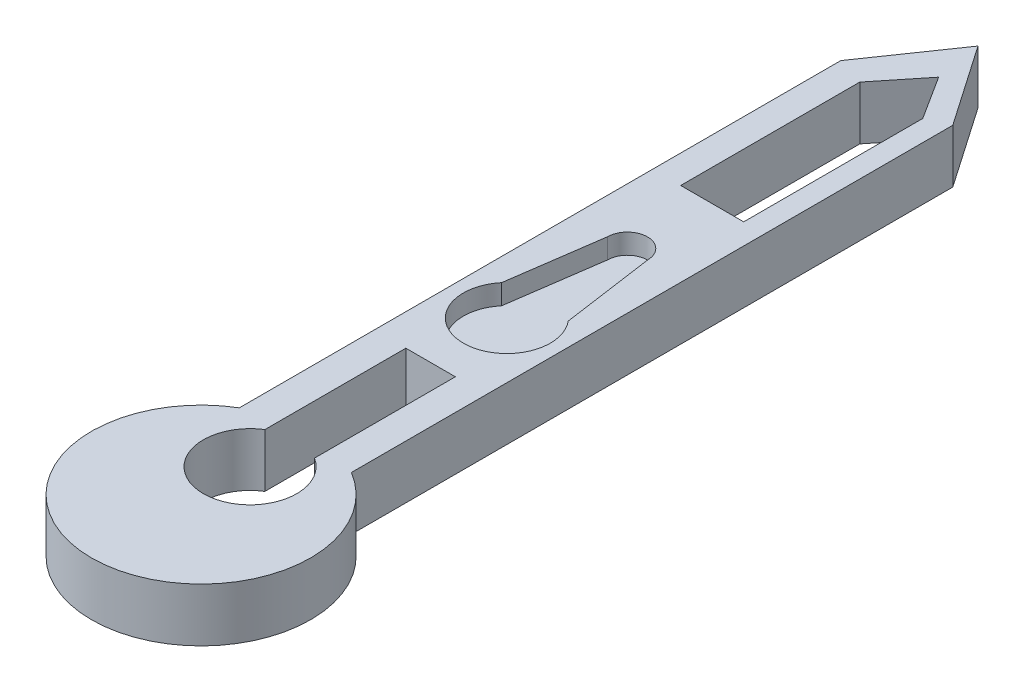
ISO-10303-21;
HEADER;
FILE_DESCRIPTION(('STEP AP214'),'2;1');
FILE_NAME('part.step','',(''),(''),'','','');
FILE_SCHEMA(('AUTOMOTIVE_DESIGN { 1 0 10303 214 1 1 1 1 }'));
ENDSEC;
DATA;
#1=APPLICATION_CONTEXT('core data for automotive mechanical design processes');
#2=APPLICATION_PROTOCOL_DEFINITION('international standard','automotive_design',2000,#1);
#3=PRODUCT_CONTEXT('',#1,'mechanical');
#4=PRODUCT('Part','Part','',(#3));
#5=PRODUCT_RELATED_PRODUCT_CATEGORY('part','',(#4));
#6=PRODUCT_DEFINITION_FORMATION('','',#4);
#7=PRODUCT_DEFINITION_CONTEXT('part definition',#1,'design');
#8=PRODUCT_DEFINITION('design','',#6,#7);
#9=PRODUCT_DEFINITION_SHAPE('','',#8);
#10=(LENGTH_UNIT() NAMED_UNIT(*) SI_UNIT(.MILLI.,.METRE.));
#11=(NAMED_UNIT(*) PLANE_ANGLE_UNIT() SI_UNIT($,.RADIAN.));
#12=(NAMED_UNIT(*) SI_UNIT($,.STERADIAN.) SOLID_ANGLE_UNIT());
#13=UNCERTAINTY_MEASURE_WITH_UNIT(LENGTH_MEASURE(1.E-05),#10,'distance_accuracy_value','');
#14=(GEOMETRIC_REPRESENTATION_CONTEXT(3) GLOBAL_UNCERTAINTY_ASSIGNED_CONTEXT((#13)) GLOBAL_UNIT_ASSIGNED_CONTEXT((#10,
#11,#12)) REPRESENTATION_CONTEXT('',''));
#15=CARTESIAN_POINT('',(0.,0.,0.));
#16=DIRECTION('',(0.,0.,1.));
#17=DIRECTION('',(1.,0.,0.));
#18=AXIS2_PLACEMENT_3D('',#15,#16,#17);
#19=CARTESIAN_POINT('',(0.,0.,0.));
#20=DIRECTION('',(0.,1.,0.));
#21=DIRECTION('',(0.,0.,1.));
#22=AXIS2_PLACEMENT_3D('',#19,#20,#21);
#23=PLANE('',#22);
#24=DIRECTION('',(0.,0.,1.));
#25=VECTOR('',#24,1.);
#26=CARTESIAN_POINT('',(3.75288070115066,0.,0.));
#27=LINE('',#26,#25);
#28=CARTESIAN_POINT('',(3.75288070115066,0.,11.4423569713047));
#29=VERTEX_POINT('',#28);
#30=CARTESIAN_POINT('',(3.75288070115066,0.,32.4909743586852));
#31=VERTEX_POINT('',#30);
#32=EDGE_CURVE('E249',#29,#31,#27,.T.);
#33=ORIENTED_EDGE('',*,*,#32,.F.);
#34=DIRECTION('',(-1.,0.,0.));
#35=VECTOR('',#34,1.);
#36=CARTESIAN_POINT('',(0.,0.,11.4423569713047));
#37=LINE('',#36,#35);
#38=CARTESIAN_POINT('',(-3.64464062702301,0.,11.4423569713047));
#39=VERTEX_POINT('',#38);
#40=EDGE_CURVE('E251',#29,#39,#37,.T.);
#41=ORIENTED_EDGE('',*,*,#40,.T.);
#42=DIRECTION('',(0.,0.,1.));
#43=VECTOR('',#42,1.);
#44=CARTESIAN_POINT('',(-3.64464062702301,0.,0.));
#45=LINE('',#44,#43);
#46=CARTESIAN_POINT('',(-3.64464062702301,0.,32.4909743586852));
#47=VERTEX_POINT('',#46);
#48=EDGE_CURVE('E246',#39,#47,#45,.T.);
#49=ORIENTED_EDGE('',*,*,#48,.T.);
#50=CARTESIAN_POINT('',(0.0541200370638229,0.,38.4062532643227));
#51=DIRECTION('',(0.,1.,0.));
#52=DIRECTION('',(0.,0.,1.));
#53=AXIS2_PLACEMENT_3D('',#50,#51,#52);
#54=CIRCLE('',#53,6.97648586192765);
#55=EDGE_CURVE('E182',#31,#47,#54,.F.);
#56=ORIENTED_EDGE('',*,*,#55,.F.);
#57=EDGE_LOOP('',(#33,#41,#49,#56));
#58=FACE_BOUND('',#57,.T.);
#59=DIRECTION('',(0.,0.,1.));
#60=VECTOR('',#59,1.);
#61=CARTESIAN_POINT('',(-8.36378985522402,0.,0.));
#62=LINE('',#61,#60);
#63=CARTESIAN_POINT('',(-8.36378985522402,0.,-58.2289710180336));
#64=VERTEX_POINT('',#63);
#65=CARTESIAN_POINT('',(-8.36378985522402,0.,31.5906404654635));
#66=VERTEX_POINT('',#65);
#67=EDGE_CURVE('E306',#64,#66,#62,.T.);
#68=ORIENTED_EDGE('',*,*,#67,.F.);
#69=DIRECTION('',(-0.567663998295123,0.,0.823260338556155));
#70=VECTOR('',#69,1.);
#71=CARTESIAN_POINT('',(-8.36378985522402,0.,-58.2289710180336));
#72=LINE('',#71,#70);
#73=CARTESIAN_POINT('',(0.,0.,-70.358640133045));
#74=VERTEX_POINT('',#73);
#75=EDGE_CURVE('E257',#74,#64,#72,.T.);
#76=ORIENTED_EDGE('',*,*,#75,.F.);
#77=DIRECTION('',(-0.567663998295123,0.,-0.823260338556155));
#78=VECTOR('',#77,1.);
#79=CARTESIAN_POINT('',(0.,0.,-70.358640133045));
#80=LINE('',#79,#78);
#81=CARTESIAN_POINT('',(8.36378985522402,0.,-58.2289710180336));
#82=VERTEX_POINT('',#81);
#83=EDGE_CURVE('E254',#82,#74,#80,.T.);
#84=ORIENTED_EDGE('',*,*,#83,.F.);
#85=DIRECTION('',(0.,0.,1.));
#86=VECTOR('',#85,1.);
#87=CARTESIAN_POINT('',(8.36378985522402,0.,0.));
#88=LINE('',#87,#86);
#89=CARTESIAN_POINT('',(8.36378985522402,0.,31.5906404654635));
#90=VERTEX_POINT('',#89);
#91=EDGE_CURVE('E308',#82,#90,#88,.T.);
#92=ORIENTED_EDGE('',*,*,#91,.T.);
#93=CARTESIAN_POINT('',(0.,0.,45.6690209059487));
#94=DIRECTION('',(0.,1.,0.));
#95=DIRECTION('',(0.,0.,1.));
#96=AXIS2_PLACEMENT_3D('',#93,#94,#95);
#97=CIRCLE('',#96,16.3754015697138);
#98=EDGE_CURVE('E54',#66,#90,#97,.T.);
#99=ORIENTED_EDGE('',*,*,#98,.F.);
#100=EDGE_LOOP('',(#68,#76,#84,#92,#99));
#101=FACE_BOUND('',#100,.T.);
#102=DIRECTION('',(0.,0.,-1.));
#103=VECTOR('',#102,1.);
#104=CARTESIAN_POINT('',(-4.16613708134531,0.,0.));
#105=LINE('',#104,#103);
#106=CARTESIAN_POINT('',(-4.16613708134531,0.,-30.1243836162418));
#107=VERTEX_POINT('',#106);
#108=CARTESIAN_POINT('',(-4.16613708134531,0.,-56.8678934147329));
#109=VERTEX_POINT('',#108);
#110=EDGE_CURVE('E244',#107,#109,#105,.T.);
#111=ORIENTED_EDGE('',*,*,#110,.F.);
#112=DIRECTION('',(-1.,0.,0.));
#113=VECTOR('',#112,1.);
#114=CARTESIAN_POINT('',(0.,0.,-30.1243836162418));
#115=LINE('',#114,#113);
#116=CARTESIAN_POINT('',(5.24359444784807,0.,-30.1243836162418));
#117=VERTEX_POINT('',#116);
#118=EDGE_CURVE('E206',#117,#107,#115,.T.);
#119=ORIENTED_EDGE('',*,*,#118,.F.);
#120=DIRECTION('',(0.,0.,-1.));
#121=VECTOR('',#120,1.);
#122=CARTESIAN_POINT('',(5.24359444784807,0.,0.));
#123=LINE('',#122,#121);
#124=CARTESIAN_POINT('',(5.24359444784809,0.,-56.8678934147329));
#125=VERTEX_POINT('',#124);
#126=EDGE_CURVE('E235',#117,#125,#123,.T.);
#127=ORIENTED_EDGE('',*,*,#126,.T.);
#128=DIRECTION('',(-0.537025215561153,0.,-0.843566190557384));
#129=VECTOR('',#128,1.);
#130=CARTESIAN_POINT('',(29.4934458877035,0.,-18.7759114966661));
#131=LINE('',#130,#129);
#132=CARTESIAN_POINT('',(1.08793799632423,0.,-63.3956525971655));
#133=VERTEX_POINT('',#132);
#134=EDGE_CURVE('E238',#125,#133,#131,.T.);
#135=ORIENTED_EDGE('',*,*,#134,.T.);
#136=DIRECTION('',(-0.627011216035181,0.,0.779010227767315));
#137=VECTOR('',#136,1.);
#138=CARTESIAN_POINT('',(-30.3052665249536,0.,-24.3921598700205));
#139=LINE('',#138,#137);
#140=EDGE_CURVE('E241',#133,#109,#139,.T.);
#141=ORIENTED_EDGE('',*,*,#140,.T.);
#142=EDGE_LOOP('',(#111,#119,#127,#135,#141));
#143=FACE_BOUND('',#142,.T.);
#144=ADVANCED_FACE('F50',(#58,#101,#143),#23,.F.);
#145=CARTESIAN_POINT('',(0.,8.,0.));
#146=DIRECTION('',(0.,1.,0.));
#147=DIRECTION('',(0.,0.,1.));
#148=AXIS2_PLACEMENT_3D('',#145,#146,#147);
#149=PLANE('',#148);
#150=DIRECTION('',(-1.,0.,0.));
#151=VECTOR('',#150,1.);
#152=CARTESIAN_POINT('',(0.,8.,11.4423569713047));
#153=LINE('',#152,#151);
#154=CARTESIAN_POINT('',(3.75288070115066,8.,11.4423569713047));
#155=VERTEX_POINT('',#154);
#156=CARTESIAN_POINT('',(-3.64464062702301,8.,11.4423569713047));
#157=VERTEX_POINT('',#156);
#158=EDGE_CURVE('E194',#155,#157,#153,.T.);
#159=ORIENTED_EDGE('',*,*,#158,.F.);
#160=DIRECTION('',(0.,0.,1.));
#161=VECTOR('',#160,1.);
#162=CARTESIAN_POINT('',(3.75288070115066,8.,0.));
#163=LINE('',#162,#161);
#164=CARTESIAN_POINT('',(3.75288070115066,8.,32.4909743586852));
#165=VERTEX_POINT('',#164);
#166=EDGE_CURVE('E199',#155,#165,#163,.T.);
#167=ORIENTED_EDGE('',*,*,#166,.T.);
#168=CARTESIAN_POINT('',(0.0541200370638229,8.,38.4062532643227));
#169=DIRECTION('',(0.,1.,0.));
#170=DIRECTION('',(0.,0.,1.));
#171=AXIS2_PLACEMENT_3D('',#168,#169,#170);
#172=CIRCLE('',#171,6.97648586192765);
#173=CARTESIAN_POINT('',(-3.64464062702301,8.,32.4909743586852));
#174=VERTEX_POINT('',#173);
#175=EDGE_CURVE('E179',#165,#174,#172,.F.);
#176=ORIENTED_EDGE('',*,*,#175,.T.);
#177=DIRECTION('',(0.,0.,1.));
#178=VECTOR('',#177,1.);
#179=CARTESIAN_POINT('',(-3.64464062702301,8.,0.));
#180=LINE('',#179,#178);
#181=EDGE_CURVE('E189',#157,#174,#180,.T.);
#182=ORIENTED_EDGE('',*,*,#181,.F.);
#183=EDGE_LOOP('',(#159,#167,#176,#182));
#184=FACE_BOUND('',#183,.T.);
#185=DIRECTION('',(0.567663998295123,0.,-0.823260338556155));
#186=VECTOR('',#185,1.);
#187=CARTESIAN_POINT('',(-32.8810730577622,8.,-22.6725381098025));
#188=LINE('',#187,#186);
#189=CARTESIAN_POINT('',(-8.36378985522402,8.,-58.2289710180336));
#190=VERTEX_POINT('',#189);
#191=CARTESIAN_POINT('',(0.,8.,-70.358640133045));
#192=VERTEX_POINT('',#191);
#193=EDGE_CURVE('E268',#190,#192,#188,.T.);
#194=ORIENTED_EDGE('',*,*,#193,.F.);
#195=DIRECTION('',(0.,0.,1.));
#196=VECTOR('',#195,1.);
#197=CARTESIAN_POINT('',(-8.36378985522402,8.,0.));
#198=LINE('',#197,#196);
#199=CARTESIAN_POINT('',(-8.36378985522402,8.,31.5906404654635));
#200=VERTEX_POINT('',#199);
#201=EDGE_CURVE('E305',#190,#200,#198,.T.);
#202=ORIENTED_EDGE('',*,*,#201,.T.);
#203=CARTESIAN_POINT('',(0.,8.,45.6690209059487));
#204=DIRECTION('',(0.,1.,0.));
#205=DIRECTION('',(0.,0.,1.));
#206=AXIS2_PLACEMENT_3D('',#203,#204,#205);
#207=CIRCLE('',#206,16.3754015697138);
#208=CARTESIAN_POINT('',(8.36378985522402,8.,31.5906404654635));
#209=VERTEX_POINT('',#208);
#210=EDGE_CURVE('E310',#200,#209,#207,.T.);
#211=ORIENTED_EDGE('',*,*,#210,.T.);
#212=DIRECTION('',(0.,0.,1.));
#213=VECTOR('',#212,1.);
#214=CARTESIAN_POINT('',(8.36378985522402,8.,0.));
#215=LINE('',#214,#213);
#216=CARTESIAN_POINT('',(8.36378985522402,8.,-58.2289710180336));
#217=VERTEX_POINT('',#216);
#218=EDGE_CURVE('E303',#217,#209,#215,.T.);
#219=ORIENTED_EDGE('',*,*,#218,.F.);
#220=DIRECTION('',(0.567663998295123,0.,0.823260338556155));
#221=VECTOR('',#220,1.);
#222=CARTESIAN_POINT('',(32.8810730577622,8.,-22.6725381098025));
#223=LINE('',#222,#221);
#224=EDGE_CURVE('E263',#192,#217,#223,.T.);
#225=ORIENTED_EDGE('',*,*,#224,.F.);
#226=EDGE_LOOP('',(#194,#202,#211,#219,#225));
#227=FACE_BOUND('',#226,.T.);
#228=CARTESIAN_POINT('',(0.,8.,0.));
#229=DIRECTION('',(0.,1.,0.));
#230=DIRECTION('',(0.,0.,1.));
#231=AXIS2_PLACEMENT_3D('',#228,#229,#230);
#232=CIRCLE('',#231,6.50000000000007);
#233=CARTESIAN_POINT('',(-4.97435621961369,8.,-4.18399094171958));
#234=VERTEX_POINT('',#233);
#235=CARTESIAN_POINT('',(4.97435621961369,8.,-4.18399094171958));
#236=VERTEX_POINT('',#235);
#237=EDGE_CURVE('E271',#234,#236,#232,.T.);
#238=ORIENTED_EDGE('',*,*,#237,.F.);
#239=DIRECTION('',(-0.141111452705608,0.,0.989993716098902));
#240=VECTOR('',#239,1.);
#241=CARTESIAN_POINT('',(-2.99977106704246,8.,-18.0370613726926));
#242=LINE('',#241,#240);
#243=CARTESIAN_POINT('',(-2.99977106704246,8.,-18.0370613726926));
#244=VERTEX_POINT('',#243);
#245=EDGE_CURVE('E276',#244,#234,#242,.T.);
#246=ORIENTED_EDGE('',*,*,#245,.F.);
#247=CARTESIAN_POINT('',(0.,8.,-18.));
#248=DIRECTION('',(0.,1.,0.));
#249=DIRECTION('',(0.,0.,1.));
#250=AXIS2_PLACEMENT_3D('',#247,#248,#249);
#251=CIRCLE('',#250,3.00000000000182);
#252=CARTESIAN_POINT('',(2.99977106704246,8.,-18.0370613726926));
#253=VERTEX_POINT('',#252);
#254=EDGE_CURVE('E290',#253,#244,#251,.T.);
#255=ORIENTED_EDGE('',*,*,#254,.F.);
#256=DIRECTION('',(-0.141111452705608,0.,-0.989993716098902));
#257=VECTOR('',#256,1.);
#258=CARTESIAN_POINT('',(4.97435621961369,8.,-4.18399094171958));
#259=LINE('',#258,#257);
#260=EDGE_CURVE('E287',#236,#253,#259,.T.);
#261=ORIENTED_EDGE('',*,*,#260,.F.);
#262=EDGE_LOOP('',(#238,#246,#255,#261));
#263=FACE_BOUND('',#262,.T.);
#264=DIRECTION('',(-1.,0.,0.));
#265=VECTOR('',#264,1.);
#266=CARTESIAN_POINT('',(0.,8.,-30.1243836162418));
#267=LINE('',#266,#265);
#268=CARTESIAN_POINT('',(5.24359444784807,8.,-30.1243836162418));
#269=VERTEX_POINT('',#268);
#270=CARTESIAN_POINT('',(-4.16613708134531,8.,-30.1243836162418));
#271=VERTEX_POINT('',#270);
#272=EDGE_CURVE('E212',#269,#271,#267,.T.);
#273=ORIENTED_EDGE('',*,*,#272,.T.);
#274=DIRECTION('',(0.,0.,-1.));
#275=VECTOR('',#274,1.);
#276=CARTESIAN_POINT('',(-4.16613708134531,8.,0.));
#277=LINE('',#276,#275);
#278=CARTESIAN_POINT('',(-4.16613708134531,8.,-56.8678934147329));
#279=VERTEX_POINT('',#278);
#280=EDGE_CURVE('E209',#271,#279,#277,.T.);
#281=ORIENTED_EDGE('',*,*,#280,.T.);
#282=DIRECTION('',(-0.627011216035181,0.,0.779010227767315));
#283=VECTOR('',#282,1.);
#284=CARTESIAN_POINT('',(-30.3052665249536,8.,-24.3921598700205));
#285=LINE('',#284,#283);
#286=CARTESIAN_POINT('',(1.08793799632423,8.,-63.3956525971655));
#287=VERTEX_POINT('',#286);
#288=EDGE_CURVE('E221',#287,#279,#285,.T.);
#289=ORIENTED_EDGE('',*,*,#288,.F.);
#290=DIRECTION('',(-0.537025215561153,0.,-0.843566190557384));
#291=VECTOR('',#290,1.);
#292=CARTESIAN_POINT('',(29.4934458877035,8.,-18.7759114966661));
#293=LINE('',#292,#291);
#294=CARTESIAN_POINT('',(5.24359444784809,8.,-56.8678934147329));
#295=VERTEX_POINT('',#294);
#296=EDGE_CURVE('E218',#295,#287,#293,.T.);
#297=ORIENTED_EDGE('',*,*,#296,.F.);
#298=DIRECTION('',(0.,0.,-1.));
#299=VECTOR('',#298,1.);
#300=CARTESIAN_POINT('',(5.24359444784807,8.,0.));
#301=LINE('',#300,#299);
#302=EDGE_CURVE('E215',#269,#295,#301,.T.);
#303=ORIENTED_EDGE('',*,*,#302,.F.);
#304=EDGE_LOOP('',(#273,#281,#289,#297,#303));
#305=FACE_BOUND('',#304,.T.);
#306=ADVANCED_FACE('F196',(#184,#227,#263,#305),#149,.T.);
#307=CARTESIAN_POINT('',(8.36378985522402,8.,0.));
#308=DIRECTION('',(1.,0.,0.));
#309=DIRECTION('',(0.,0.,-1.));
#310=AXIS2_PLACEMENT_3D('',#307,#308,#309);
#311=PLANE('',#310);
#312=DIRECTION('',(0.,-1.,0.));
#313=VECTOR('',#312,1.);
#314=CARTESIAN_POINT('',(8.36378985522402,23.,-58.2289710180336));
#315=LINE('',#314,#313);
#316=EDGE_CURVE('E259',#217,#82,#315,.T.);
#317=ORIENTED_EDGE('',*,*,#316,.F.);
#318=ORIENTED_EDGE('',*,*,#218,.T.);
#319=DIRECTION('',(0.,-1.,0.));
#320=VECTOR('',#319,1.);
#321=CARTESIAN_POINT('',(8.36378985522402,8.,31.5906404654635));
#322=LINE('',#321,#320);
#323=EDGE_CURVE('E12',#209,#90,#322,.T.);
#324=ORIENTED_EDGE('',*,*,#323,.T.);
#325=ORIENTED_EDGE('',*,*,#91,.F.);
#326=EDGE_LOOP('',(#317,#318,#324,#325));
#327=FACE_BOUND('',#326,.T.);
#328=ADVANCED_FACE('F329',(#327),#311,.T.);
#329=CARTESIAN_POINT('',(-8.36378985522402,8.,0.));
#330=DIRECTION('',(1.,0.,0.));
#331=DIRECTION('',(0.,0.,-1.));
#332=AXIS2_PLACEMENT_3D('',#329,#330,#331);
#333=PLANE('',#332);
#334=ORIENTED_EDGE('',*,*,#201,.F.);
#335=DIRECTION('',(0.,-1.,0.));
#336=VECTOR('',#335,1.);
#337=CARTESIAN_POINT('',(-8.36378985522402,23.,-58.2289710180336));
#338=LINE('',#337,#336);
#339=EDGE_CURVE('E260',#190,#64,#338,.T.);
#340=ORIENTED_EDGE('',*,*,#339,.T.);
#341=ORIENTED_EDGE('',*,*,#67,.T.);
#342=DIRECTION('',(0.,-1.,0.));
#343=VECTOR('',#342,1.);
#344=CARTESIAN_POINT('',(-8.36378985522402,8.,31.5906404654635));
#345=LINE('',#344,#343);
#346=EDGE_CURVE('E59',#200,#66,#345,.T.);
#347=ORIENTED_EDGE('',*,*,#346,.F.);
#348=EDGE_LOOP('',(#334,#340,#341,#347));
#349=FACE_BOUND('',#348,.T.);
#350=ADVANCED_FACE('F339',(#349),#333,.F.);
#351=CARTESIAN_POINT('',(0.,8.,45.6690209059487));
#352=DIRECTION('',(0.,-1.,0.));
#353=DIRECTION('',(0.,0.,-1.));
#354=AXIS2_PLACEMENT_3D('',#351,#352,#353);
#355=CYLINDRICAL_SURFACE('',#354,16.3754015697138);
#356=ORIENTED_EDGE('',*,*,#323,.F.);
#357=ORIENTED_EDGE('',*,*,#210,.F.);
#358=ORIENTED_EDGE('',*,*,#346,.T.);
#359=ORIENTED_EDGE('',*,*,#98,.T.);
#360=EDGE_LOOP('',(#356,#357,#358,#359));
#361=FACE_BOUND('',#360,.T.);
#362=ADVANCED_FACE('F52',(#361),#355,.T.);
#363=CARTESIAN_POINT('',(0.,5.,0.));
#364=DIRECTION('',(0.,1.,0.));
#365=DIRECTION('',(0.,0.,1.));
#366=AXIS2_PLACEMENT_3D('',#363,#364,#365);
#367=CYLINDRICAL_SURFACE('',#366,6.50000000000007);
#368=ORIENTED_EDGE('',*,*,#237,.T.);
#369=DIRECTION('',(0.,1.,0.));
#370=VECTOR('',#369,1.);
#371=CARTESIAN_POINT('',(4.97435621961369,5.,-4.18399094171958));
#372=LINE('',#371,#370);
#373=CARTESIAN_POINT('',(4.97435621961369,5.,-4.18399094171958));
#374=VERTEX_POINT('',#373);
#375=EDGE_CURVE('E285',#374,#236,#372,.T.);
#376=ORIENTED_EDGE('',*,*,#375,.F.);
#377=CARTESIAN_POINT('',(0.,5.,0.));
#378=DIRECTION('',(0.,1.,0.));
#379=DIRECTION('',(0.,0.,1.));
#380=AXIS2_PLACEMENT_3D('',#377,#378,#379);
#381=CIRCLE('',#380,6.50000000000007);
#382=CARTESIAN_POINT('',(-4.97435621961369,5.,-4.18399094171958));
#383=VERTEX_POINT('',#382);
#384=EDGE_CURVE('E272',#383,#374,#381,.T.);
#385=ORIENTED_EDGE('',*,*,#384,.F.);
#386=DIRECTION('',(0.,1.,0.));
#387=VECTOR('',#386,1.);
#388=CARTESIAN_POINT('',(-4.97435621961369,5.,-4.18399094171958));
#389=LINE('',#388,#387);
#390=EDGE_CURVE('E295',#383,#234,#389,.T.);
#391=ORIENTED_EDGE('',*,*,#390,.T.);
#392=EDGE_LOOP('',(#368,#376,#385,#391));
#393=FACE_BOUND('',#392,.T.);
#394=ADVANCED_FACE('F346',(#393),#367,.F.);
#395=CARTESIAN_POINT('',(-2.99977106704246,5.,-18.0370613726926));
#396=DIRECTION('',(-0.989993716098902,0.,-0.141111452705608));
#397=DIRECTION('',(-0.141111452705608,0.,0.989993716098902));
#398=AXIS2_PLACEMENT_3D('',#395,#396,#397);
#399=PLANE('',#398);
#400=ORIENTED_EDGE('',*,*,#245,.T.);
#401=ORIENTED_EDGE('',*,*,#390,.F.);
#402=DIRECTION('',(-0.141111452705608,0.,0.989993716098902));
#403=VECTOR('',#402,1.);
#404=CARTESIAN_POINT('',(-2.99977106704246,5.,-18.0370613726926));
#405=LINE('',#404,#403);
#406=CARTESIAN_POINT('',(-2.99977106704246,5.,-18.0370613726926));
#407=VERTEX_POINT('',#406);
#408=EDGE_CURVE('E282',#407,#383,#405,.T.);
#409=ORIENTED_EDGE('',*,*,#408,.F.);
#410=DIRECTION('',(0.,1.,0.));
#411=VECTOR('',#410,1.);
#412=CARTESIAN_POINT('',(-2.99977106704246,5.,-18.0370613726926));
#413=LINE('',#412,#411);
#414=EDGE_CURVE('E297',#407,#244,#413,.T.);
#415=ORIENTED_EDGE('',*,*,#414,.T.);
#416=EDGE_LOOP('',(#400,#401,#409,#415));
#417=FACE_BOUND('',#416,.T.);
#418=ADVANCED_FACE('F358',(#417),#399,.F.);
#419=CARTESIAN_POINT('',(0.,5.,-18.));
#420=DIRECTION('',(0.,1.,0.));
#421=DIRECTION('',(0.,0.,1.));
#422=AXIS2_PLACEMENT_3D('',#419,#420,#421);
#423=CYLINDRICAL_SURFACE('',#422,3.00000000000182);
#424=ORIENTED_EDGE('',*,*,#254,.T.);
#425=ORIENTED_EDGE('',*,*,#414,.F.);
#426=CARTESIAN_POINT('',(0.,5.,-18.));
#427=DIRECTION('',(0.,1.,0.));
#428=DIRECTION('',(0.,0.,1.));
#429=AXIS2_PLACEMENT_3D('',#426,#427,#428);
#430=CIRCLE('',#429,3.00000000000182);
#431=CARTESIAN_POINT('',(2.99977106704246,5.,-18.0370613726926));
#432=VERTEX_POINT('',#431);
#433=EDGE_CURVE('E279',#432,#407,#430,.T.);
#434=ORIENTED_EDGE('',*,*,#433,.F.);
#435=DIRECTION('',(0.,1.,0.));
#436=VECTOR('',#435,1.);
#437=CARTESIAN_POINT('',(2.99977106704246,5.,-18.0370613726926));
#438=LINE('',#437,#436);
#439=EDGE_CURVE('E299',#432,#253,#438,.T.);
#440=ORIENTED_EDGE('',*,*,#439,.T.);
#441=EDGE_LOOP('',(#424,#425,#434,#440));
#442=FACE_BOUND('',#441,.T.);
#443=ADVANCED_FACE('F364',(#442),#423,.F.);
#444=CARTESIAN_POINT('',(4.97435621961369,5.,-4.18399094171958));
#445=DIRECTION('',(0.989993716098902,0.,-0.141111452705608));
#446=DIRECTION('',(-0.141111452705608,0.,-0.989993716098902));
#447=AXIS2_PLACEMENT_3D('',#444,#445,#446);
#448=PLANE('',#447);
#449=ORIENTED_EDGE('',*,*,#260,.T.);
#450=ORIENTED_EDGE('',*,*,#439,.F.);
#451=DIRECTION('',(-0.141111452705608,0.,-0.989993716098902));
#452=VECTOR('',#451,1.);
#453=CARTESIAN_POINT('',(4.97435621961369,5.,-4.18399094171958));
#454=LINE('',#453,#452);
#455=EDGE_CURVE('E275',#374,#432,#454,.T.);
#456=ORIENTED_EDGE('',*,*,#455,.F.);
#457=ORIENTED_EDGE('',*,*,#375,.T.);
#458=EDGE_LOOP('',(#449,#450,#456,#457));
#459=FACE_BOUND('',#458,.T.);
#460=ADVANCED_FACE('F360',(#459),#448,.F.);
#461=CARTESIAN_POINT('',(0.,5.,0.));
#462=DIRECTION('',(0.,1.,0.));
#463=DIRECTION('',(0.,0.,1.));
#464=AXIS2_PLACEMENT_3D('',#461,#462,#463);
#465=PLANE('',#464);
#466=ORIENTED_EDGE('',*,*,#384,.T.);
#467=ORIENTED_EDGE('',*,*,#455,.T.);
#468=ORIENTED_EDGE('',*,*,#433,.T.);
#469=ORIENTED_EDGE('',*,*,#408,.T.);
#470=EDGE_LOOP('',(#466,#467,#468,#469));
#471=FACE_BOUND('',#470,.T.);
#472=ADVANCED_FACE('F363',(#471),#465,.T.);
#473=CARTESIAN_POINT('',(-8.36378985522402,23.,-58.2289710180336));
#474=DIRECTION('',(0.823260338556155,0.,0.567663998295123));
#475=DIRECTION('',(0.567663998295123,0.,-0.823260338556155));
#476=AXIS2_PLACEMENT_3D('',#473,#474,#475);
#477=PLANE('',#476);
#478=ORIENTED_EDGE('',*,*,#193,.T.);
#479=DIRECTION('',(0.,-1.,0.));
#480=VECTOR('',#479,1.);
#481=CARTESIAN_POINT('',(0.,23.,-70.358640133045));
#482=LINE('',#481,#480);
#483=EDGE_CURVE('E264',#192,#74,#482,.T.);
#484=ORIENTED_EDGE('',*,*,#483,.T.);
#485=ORIENTED_EDGE('',*,*,#75,.T.);
#486=ORIENTED_EDGE('',*,*,#339,.F.);
#487=EDGE_LOOP('',(#478,#484,#485,#486));
#488=FACE_BOUND('',#487,.T.);
#489=ADVANCED_FACE('F337',(#488),#477,.F.);
#490=CARTESIAN_POINT('',(0.,23.,-70.358640133045));
#491=DIRECTION('',(-0.823260338556155,0.,0.567663998295123));
#492=DIRECTION('',(0.567663998295123,0.,0.823260338556155));
#493=AXIS2_PLACEMENT_3D('',#490,#491,#492);
#494=PLANE('',#493);
#495=ORIENTED_EDGE('',*,*,#224,.T.);
#496=ORIENTED_EDGE('',*,*,#316,.T.);
#497=ORIENTED_EDGE('',*,*,#83,.T.);
#498=ORIENTED_EDGE('',*,*,#483,.F.);
#499=EDGE_LOOP('',(#495,#496,#497,#498));
#500=FACE_BOUND('',#499,.T.);
#501=ADVANCED_FACE('F335',(#500),#494,.F.);
#502=CARTESIAN_POINT('',(-4.16613708134531,-2.,0.));
#503=DIRECTION('',(1.,0.,0.));
#504=DIRECTION('',(0.,0.,-1.));
#505=AXIS2_PLACEMENT_3D('',#502,#503,#504);
#506=PLANE('',#505);
#507=ORIENTED_EDGE('',*,*,#110,.T.);
#508=DIRECTION('',(0.,1.,0.));
#509=VECTOR('',#508,1.);
#510=CARTESIAN_POINT('',(-4.16613708134531,-2.,-56.8678934147329));
#511=LINE('',#510,#509);
#512=EDGE_CURVE('E225',#109,#279,#511,.T.);
#513=ORIENTED_EDGE('',*,*,#512,.T.);
#514=ORIENTED_EDGE('',*,*,#280,.F.);
#515=DIRECTION('',(0.,1.,0.));
#516=VECTOR('',#515,1.);
#517=CARTESIAN_POINT('',(-4.16613708134531,-2.,-30.1243836162418));
#518=LINE('',#517,#516);
#519=EDGE_CURVE('E224',#107,#271,#518,.T.);
#520=ORIENTED_EDGE('',*,*,#519,.F.);
#521=EDGE_LOOP('',(#507,#513,#514,#520));
#522=FACE_BOUND('',#521,.T.);
#523=ADVANCED_FACE('F377',(#522),#506,.T.);
#524=CARTESIAN_POINT('',(-30.3052665249536,-2.,-24.3921598700205));
#525=DIRECTION('',(-0.779010227767315,0.,-0.627011216035181));
#526=DIRECTION('',(-0.627011216035181,0.,0.779010227767315));
#527=AXIS2_PLACEMENT_3D('',#524,#525,#526);
#528=PLANE('',#527);
#529=DIRECTION('',(0.,1.,0.));
#530=VECTOR('',#529,1.);
#531=CARTESIAN_POINT('',(1.08793799632423,-2.,-63.3956525971655));
#532=LINE('',#531,#530);
#533=EDGE_CURVE('E227',#133,#287,#532,.T.);
#534=ORIENTED_EDGE('',*,*,#533,.T.);
#535=ORIENTED_EDGE('',*,*,#288,.T.);
#536=ORIENTED_EDGE('',*,*,#512,.F.);
#537=ORIENTED_EDGE('',*,*,#140,.F.);
#538=EDGE_LOOP('',(#534,#535,#536,#537));
#539=FACE_BOUND('',#538,.T.);
#540=ADVANCED_FACE('F382',(#539),#528,.F.);
#541=CARTESIAN_POINT('',(29.4934458877035,-2.,-18.7759114966661));
#542=DIRECTION('',(0.843566190557384,0.,-0.537025215561153));
#543=DIRECTION('',(-0.537025215561153,0.,-0.843566190557384));
#544=AXIS2_PLACEMENT_3D('',#541,#542,#543);
#545=PLANE('',#544);
#546=DIRECTION('',(0.,1.,0.));
#547=VECTOR('',#546,1.);
#548=CARTESIAN_POINT('',(5.24359444784809,-2.,-56.8678934147329));
#549=LINE('',#548,#547);
#550=EDGE_CURVE('E229',#125,#295,#549,.T.);
#551=ORIENTED_EDGE('',*,*,#550,.T.);
#552=ORIENTED_EDGE('',*,*,#296,.T.);
#553=ORIENTED_EDGE('',*,*,#533,.F.);
#554=ORIENTED_EDGE('',*,*,#134,.F.);
#555=EDGE_LOOP('',(#551,#552,#553,#554));
#556=FACE_BOUND('',#555,.T.);
#557=ADVANCED_FACE('F391',(#556),#545,.F.);
#558=CARTESIAN_POINT('',(5.24359444784807,-2.,0.));
#559=DIRECTION('',(1.,0.,0.));
#560=DIRECTION('',(0.,0.,-1.));
#561=AXIS2_PLACEMENT_3D('',#558,#559,#560);
#562=PLANE('',#561);
#563=DIRECTION('',(0.,1.,0.));
#564=VECTOR('',#563,1.);
#565=CARTESIAN_POINT('',(5.24359444784807,-2.,-30.1243836162418));
#566=LINE('',#565,#564);
#567=EDGE_CURVE('E75',#117,#269,#566,.T.);
#568=ORIENTED_EDGE('',*,*,#567,.T.);
#569=ORIENTED_EDGE('',*,*,#302,.T.);
#570=ORIENTED_EDGE('',*,*,#550,.F.);
#571=ORIENTED_EDGE('',*,*,#126,.F.);
#572=EDGE_LOOP('',(#568,#569,#570,#571));
#573=FACE_BOUND('',#572,.T.);
#574=ADVANCED_FACE('F388',(#573),#562,.F.);
#575=CARTESIAN_POINT('',(0.,-2.,-30.1243836162418));
#576=DIRECTION('',(0.,0.,-1.));
#577=DIRECTION('',(-1.,0.,0.));
#578=AXIS2_PLACEMENT_3D('',#575,#576,#577);
#579=PLANE('',#578);
#580=ORIENTED_EDGE('',*,*,#118,.T.);
#581=ORIENTED_EDGE('',*,*,#519,.T.);
#582=ORIENTED_EDGE('',*,*,#272,.F.);
#583=ORIENTED_EDGE('',*,*,#567,.F.);
#584=EDGE_LOOP('',(#580,#581,#582,#583));
#585=FACE_BOUND('',#584,.T.);
#586=ADVANCED_FACE('F384',(#585),#579,.T.);
#587=CARTESIAN_POINT('',(0.,-2.,11.4423569713047));
#588=DIRECTION('',(0.,0.,-1.));
#589=DIRECTION('',(-1.,0.,0.));
#590=AXIS2_PLACEMENT_3D('',#587,#588,#589);
#591=PLANE('',#590);
#592=DIRECTION('',(0.,1.,0.));
#593=VECTOR('',#592,1.);
#594=CARTESIAN_POINT('',(3.75288070115066,-2.,11.4423569713047));
#595=LINE('',#594,#593);
#596=EDGE_CURVE('E204',#29,#155,#595,.T.);
#597=ORIENTED_EDGE('',*,*,#596,.T.);
#598=ORIENTED_EDGE('',*,*,#158,.T.);
#599=DIRECTION('',(0.,1.,0.));
#600=VECTOR('',#599,1.);
#601=CARTESIAN_POINT('',(-3.64464062702301,-2.,11.4423569713047));
#602=LINE('',#601,#600);
#603=EDGE_CURVE('E185',#39,#157,#602,.T.);
#604=ORIENTED_EDGE('',*,*,#603,.F.);
#605=ORIENTED_EDGE('',*,*,#40,.F.);
#606=EDGE_LOOP('',(#597,#598,#604,#605));
#607=FACE_BOUND('',#606,.T.);
#608=ADVANCED_FACE('F387',(#607),#591,.F.);
#609=CARTESIAN_POINT('',(3.75288070115066,-2.,0.));
#610=DIRECTION('',(-1.,0.,0.));
#611=DIRECTION('',(0.,0.,1.));
#612=AXIS2_PLACEMENT_3D('',#609,#610,#611);
#613=PLANE('',#612);
#614=ORIENTED_EDGE('',*,*,#32,.T.);
#615=DIRECTION('',(0.,1.,0.));
#616=VECTOR('',#615,1.);
#617=CARTESIAN_POINT('',(3.75288070115066,-2.,32.4909743586852));
#618=LINE('',#617,#616);
#619=EDGE_CURVE('E184',#31,#165,#618,.T.);
#620=ORIENTED_EDGE('',*,*,#619,.T.);
#621=ORIENTED_EDGE('',*,*,#166,.F.);
#622=ORIENTED_EDGE('',*,*,#596,.F.);
#623=EDGE_LOOP('',(#614,#620,#621,#622));
#624=FACE_BOUND('',#623,.T.);
#625=ADVANCED_FACE('F401',(#624),#613,.T.);
#626=CARTESIAN_POINT('',(0.0541200370638229,-2.,38.4062532643227));
#627=DIRECTION('',(0.,1.,0.));
#628=DIRECTION('',(0.,0.,1.));
#629=AXIS2_PLACEMENT_3D('',#626,#627,#628);
#630=CYLINDRICAL_SURFACE('',#629,6.97648586192765);
#631=ORIENTED_EDGE('',*,*,#55,.T.);
#632=DIRECTION('',(0.,1.,0.));
#633=VECTOR('',#632,1.);
#634=CARTESIAN_POINT('',(-3.64464062702301,-2.,32.4909743586852));
#635=LINE('',#634,#633);
#636=EDGE_CURVE('E67',#47,#174,#635,.T.);
#637=ORIENTED_EDGE('',*,*,#636,.T.);
#638=ORIENTED_EDGE('',*,*,#175,.F.);
#639=ORIENTED_EDGE('',*,*,#619,.F.);
#640=EDGE_LOOP('',(#631,#637,#638,#639));
#641=FACE_BOUND('',#640,.T.);
#642=ADVANCED_FACE('F176',(#641),#630,.F.);
#643=CARTESIAN_POINT('',(-3.64464062702301,-2.,0.));
#644=DIRECTION('',(-1.,0.,0.));
#645=DIRECTION('',(0.,0.,1.));
#646=AXIS2_PLACEMENT_3D('',#643,#644,#645);
#647=PLANE('',#646);
#648=ORIENTED_EDGE('',*,*,#603,.T.);
#649=ORIENTED_EDGE('',*,*,#181,.T.);
#650=ORIENTED_EDGE('',*,*,#636,.F.);
#651=ORIENTED_EDGE('',*,*,#48,.F.);
#652=EDGE_LOOP('',(#648,#649,#650,#651));
#653=FACE_BOUND('',#652,.T.);
#654=ADVANCED_FACE('F190',(#653),#647,.F.);
#655=CLOSED_SHELL('',(#144,#306,#328,#350,#362,#394,#418,#443,#460,#472,#489,#501,#523,#540,
#557,#574,#586,#608,#625,#642,#654));
#656=MANIFOLD_SOLID_BREP('B2',#655);
#657=ADVANCED_BREP_SHAPE_REPRESENTATION('',(#18,#656),#14);
#658=SHAPE_DEFINITION_REPRESENTATION(#9,#657);
ENDSEC;
END-ISO-10303-21;
